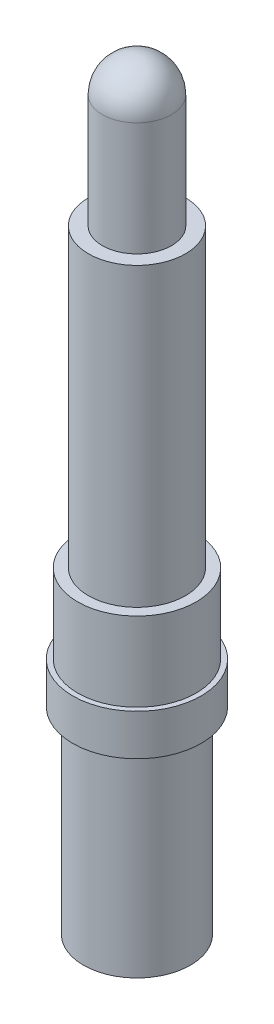
ISO-10303-21;
HEADER;
FILE_DESCRIPTION(('STEP AP214'),'2;1');
FILE_NAME('part.step','',(''),(''),'','','');
FILE_SCHEMA(('AUTOMOTIVE_DESIGN { 1 0 10303 214 1 1 1 1 }'));
ENDSEC;
DATA;
#1=APPLICATION_CONTEXT('core data for automotive mechanical design processes');
#2=APPLICATION_PROTOCOL_DEFINITION('international standard','automotive_design',2000,#1);
#3=PRODUCT_CONTEXT('',#1,'mechanical');
#4=PRODUCT('Part','Part','',(#3));
#5=PRODUCT_RELATED_PRODUCT_CATEGORY('part','',(#4));
#6=PRODUCT_DEFINITION_FORMATION('','',#4);
#7=PRODUCT_DEFINITION_CONTEXT('part definition',#1,'design');
#8=PRODUCT_DEFINITION('design','',#6,#7);
#9=PRODUCT_DEFINITION_SHAPE('','',#8);
#10=(LENGTH_UNIT() NAMED_UNIT(*) SI_UNIT(.MILLI.,.METRE.));
#11=(NAMED_UNIT(*) PLANE_ANGLE_UNIT() SI_UNIT($,.RADIAN.));
#12=(NAMED_UNIT(*) SI_UNIT($,.STERADIAN.) SOLID_ANGLE_UNIT());
#13=UNCERTAINTY_MEASURE_WITH_UNIT(LENGTH_MEASURE(1.E-05),#10,'distance_accuracy_value','');
#14=(GEOMETRIC_REPRESENTATION_CONTEXT(3) GLOBAL_UNCERTAINTY_ASSIGNED_CONTEXT((#13)) GLOBAL_UNIT_ASSIGNED_CONTEXT((#10,
#11,#12)) REPRESENTATION_CONTEXT('',''));
#15=CARTESIAN_POINT('',(0.,0.,0.));
#16=DIRECTION('',(0.,0.,1.));
#17=DIRECTION('',(1.,0.,0.));
#18=AXIS2_PLACEMENT_3D('',#15,#16,#17);
#19=CARTESIAN_POINT('',(0.,11.2268,0.));
#20=DIRECTION('',(0.,1.,0.));
#21=DIRECTION('',(1.,0.,0.));
#22=AXIS2_PLACEMENT_3D('',#19,#20,#21);
#23=SPHERICAL_SURFACE('',#22,0.533399999999996);
#24=CARTESIAN_POINT('',(0.,11.2268,0.));
#25=DIRECTION('',(0.,1.,0.));
#26=DIRECTION('',(0.,0.,1.));
#27=AXIS2_PLACEMENT_3D('',#24,#25,#26);
#28=CIRCLE('',#27,0.5334);
#29=CARTESIAN_POINT('',(0.,11.2268,0.5334));
#30=VERTEX_POINT('',#29);
#31=EDGE_CURVE('E10',#30,#30,#28,.T.);
#32=ORIENTED_EDGE('',*,*,#31,.T.);
#33=EDGE_LOOP('',(#32));
#34=FACE_BOUND('',#33,.T.);
#35=ADVANCED_FACE('F35',(#34),#23,.T.);
#36=CARTESIAN_POINT('',(0.,0.,0.));
#37=DIRECTION('',(0.,1.,0.));
#38=DIRECTION('',(0.,0.,1.));
#39=AXIS2_PLACEMENT_3D('',#36,#37,#38);
#40=CYLINDRICAL_SURFACE('',#39,0.5334);
#41=ORIENTED_EDGE('',*,*,#31,.F.);
#42=EDGE_LOOP('',(#41));
#43=FACE_BOUND('',#42,.T.);
#44=CARTESIAN_POINT('',(0.,9.4742,0.));
#45=DIRECTION('',(0.,1.,0.));
#46=DIRECTION('',(0.,0.,1.));
#47=AXIS2_PLACEMENT_3D('',#44,#45,#46);
#48=CIRCLE('',#47,0.5334);
#49=CARTESIAN_POINT('',(0.,9.4742,0.5334));
#50=VERTEX_POINT('',#49);
#51=EDGE_CURVE('E41',#50,#50,#48,.T.);
#52=ORIENTED_EDGE('',*,*,#51,.T.);
#53=EDGE_LOOP('',(#52));
#54=FACE_BOUND('',#53,.T.);
#55=ADVANCED_FACE('F85',(#43,#54),#40,.T.);
#56=CARTESIAN_POINT('',(0.5334,9.4742,0.));
#57=DIRECTION('',(0.,-1.,0.));
#58=DIRECTION('',(0.,0.,-1.));
#59=AXIS2_PLACEMENT_3D('',#56,#57,#58);
#60=PLANE('',#59);
#61=ORIENTED_EDGE('',*,*,#51,.F.);
#62=EDGE_LOOP('',(#61));
#63=FACE_BOUND('',#62,.T.);
#64=CARTESIAN_POINT('',(0.,9.4742,0.));
#65=DIRECTION('',(0.,1.,0.));
#66=DIRECTION('',(0.,0.,1.));
#67=AXIS2_PLACEMENT_3D('',#64,#65,#66);
#68=CIRCLE('',#67,0.7493);
#69=CARTESIAN_POINT('',(0.,9.4742,0.7493));
#70=VERTEX_POINT('',#69);
#71=EDGE_CURVE('E45',#70,#70,#68,.T.);
#72=ORIENTED_EDGE('',*,*,#71,.T.);
#73=EDGE_LOOP('',(#72));
#74=FACE_BOUND('',#73,.T.);
#75=ADVANCED_FACE('F89',(#63,#74),#60,.F.);
#76=CARTESIAN_POINT('',(0.,0.,0.));
#77=DIRECTION('',(0.,1.,0.));
#78=DIRECTION('',(0.,0.,1.));
#79=AXIS2_PLACEMENT_3D('',#76,#77,#78);
#80=CYLINDRICAL_SURFACE('',#79,0.749299999999999);
#81=ORIENTED_EDGE('',*,*,#71,.F.);
#82=EDGE_LOOP('',(#81));
#83=FACE_BOUND('',#82,.T.);
#84=CARTESIAN_POINT('',(0.,4.9022,0.));
#85=DIRECTION('',(0.,1.,0.));
#86=DIRECTION('',(0.,0.,1.));
#87=AXIS2_PLACEMENT_3D('',#84,#85,#86);
#88=CIRCLE('',#87,0.749299999999999);
#89=CARTESIAN_POINT('',(0.,4.9022,0.749299999999999));
#90=VERTEX_POINT('',#89);
#91=EDGE_CURVE('E49',#90,#90,#88,.T.);
#92=ORIENTED_EDGE('',*,*,#91,.T.);
#93=EDGE_LOOP('',(#92));
#94=FACE_BOUND('',#93,.T.);
#95=ADVANCED_FACE('F94',(#83,#94),#80,.T.);
#96=CARTESIAN_POINT('',(0.749299999999999,4.9022,0.));
#97=DIRECTION('',(0.,-1.,0.));
#98=DIRECTION('',(0.,0.,-1.));
#99=AXIS2_PLACEMENT_3D('',#96,#97,#98);
#100=PLANE('',#99);
#101=ORIENTED_EDGE('',*,*,#91,.F.);
#102=EDGE_LOOP('',(#101));
#103=FACE_BOUND('',#102,.T.);
#104=CARTESIAN_POINT('',(0.,4.9022,0.));
#105=DIRECTION('',(0.,1.,0.));
#106=DIRECTION('',(0.,0.,1.));
#107=AXIS2_PLACEMENT_3D('',#104,#105,#106);
#108=CIRCLE('',#107,0.914399999999999);
#109=CARTESIAN_POINT('',(0.,4.9022,0.914399999999999));
#110=VERTEX_POINT('',#109);
#111=EDGE_CURVE('E54',#110,#110,#108,.T.);
#112=ORIENTED_EDGE('',*,*,#111,.T.);
#113=EDGE_LOOP('',(#112));
#114=FACE_BOUND('',#113,.T.);
#115=ADVANCED_FACE('F100',(#103,#114),#100,.F.);
#116=CARTESIAN_POINT('',(0.,0.,0.));
#117=DIRECTION('',(0.,1.,0.));
#118=DIRECTION('',(0.,0.,1.));
#119=AXIS2_PLACEMENT_3D('',#116,#117,#118);
#120=CYLINDRICAL_SURFACE('',#119,0.9144);
#121=ORIENTED_EDGE('',*,*,#111,.F.);
#122=EDGE_LOOP('',(#121));
#123=FACE_BOUND('',#122,.T.);
#124=CARTESIAN_POINT('',(0.,3.683,0.));
#125=DIRECTION('',(0.,1.,0.));
#126=DIRECTION('',(0.,0.,1.));
#127=AXIS2_PLACEMENT_3D('',#124,#125,#126);
#128=CIRCLE('',#127,0.9144);
#129=CARTESIAN_POINT('',(0.,3.683,0.9144));
#130=VERTEX_POINT('',#129);
#131=EDGE_CURVE('E57',#130,#130,#128,.T.);
#132=ORIENTED_EDGE('',*,*,#131,.T.);
#133=EDGE_LOOP('',(#132));
#134=FACE_BOUND('',#133,.T.);
#135=ADVANCED_FACE('F104',(#123,#134),#120,.T.);
#136=CARTESIAN_POINT('',(0.9144,3.683,0.));
#137=DIRECTION('',(0.,-1.,0.));
#138=DIRECTION('',(0.,0.,-1.));
#139=AXIS2_PLACEMENT_3D('',#136,#137,#138);
#140=PLANE('',#139);
#141=ORIENTED_EDGE('',*,*,#131,.F.);
#142=EDGE_LOOP('',(#141));
#143=FACE_BOUND('',#142,.T.);
#144=CARTESIAN_POINT('',(0.,3.683,0.));
#145=DIRECTION('',(0.,1.,0.));
#146=DIRECTION('',(0.,0.,1.));
#147=AXIS2_PLACEMENT_3D('',#144,#145,#146);
#148=CIRCLE('',#147,0.9906);
#149=CARTESIAN_POINT('',(0.,3.683,0.9906));
#150=VERTEX_POINT('',#149);
#151=EDGE_CURVE('E60',#150,#150,#148,.T.);
#152=ORIENTED_EDGE('',*,*,#151,.T.);
#153=EDGE_LOOP('',(#152));
#154=FACE_BOUND('',#153,.T.);
#155=ADVANCED_FACE('F108',(#143,#154),#140,.F.);
#156=CARTESIAN_POINT('',(0.,0.,0.));
#157=DIRECTION('',(0.,1.,0.));
#158=DIRECTION('',(0.,0.,1.));
#159=AXIS2_PLACEMENT_3D('',#156,#157,#158);
#160=CYLINDRICAL_SURFACE('',#159,0.9906);
#161=ORIENTED_EDGE('',*,*,#151,.F.);
#162=EDGE_LOOP('',(#161));
#163=FACE_BOUND('',#162,.T.);
#164=CARTESIAN_POINT('',(0.,3.048,0.));
#165=DIRECTION('',(0.,1.,0.));
#166=DIRECTION('',(0.,0.,1.));
#167=AXIS2_PLACEMENT_3D('',#164,#165,#166);
#168=CIRCLE('',#167,0.9906);
#169=CARTESIAN_POINT('',(0.,3.048,0.9906));
#170=VERTEX_POINT('',#169);
#171=EDGE_CURVE('E63',#170,#170,#168,.T.);
#172=ORIENTED_EDGE('',*,*,#171,.T.);
#173=EDGE_LOOP('',(#172));
#174=FACE_BOUND('',#173,.T.);
#175=ADVANCED_FACE('F112',(#163,#174),#160,.T.);
#176=CARTESIAN_POINT('',(0.9906,3.048,0.));
#177=DIRECTION('',(0.,1.,0.));
#178=DIRECTION('',(0.,0.,1.));
#179=AXIS2_PLACEMENT_3D('',#176,#177,#178);
#180=PLANE('',#179);
#181=ORIENTED_EDGE('',*,*,#171,.F.);
#182=EDGE_LOOP('',(#181));
#183=FACE_BOUND('',#182,.T.);
#184=CARTESIAN_POINT('',(0.,3.048,0.));
#185=DIRECTION('',(0.,1.,0.));
#186=DIRECTION('',(0.,0.,1.));
#187=AXIS2_PLACEMENT_3D('',#184,#185,#186);
#188=CIRCLE('',#187,0.8255);
#189=CARTESIAN_POINT('',(0.,3.048,0.8255));
#190=VERTEX_POINT('',#189);
#191=EDGE_CURVE('E66',#190,#190,#188,.T.);
#192=ORIENTED_EDGE('',*,*,#191,.T.);
#193=EDGE_LOOP('',(#192));
#194=FACE_BOUND('',#193,.T.);
#195=ADVANCED_FACE('F81',(#183,#194),#180,.F.);
#196=CARTESIAN_POINT('',(0.,0.,0.));
#197=DIRECTION('',(0.,1.,0.));
#198=DIRECTION('',(0.,0.,1.));
#199=AXIS2_PLACEMENT_3D('',#196,#197,#198);
#200=CYLINDRICAL_SURFACE('',#199,0.8255);
#201=ORIENTED_EDGE('',*,*,#191,.F.);
#202=EDGE_LOOP('',(#201));
#203=FACE_BOUND('',#202,.T.);
#204=CARTESIAN_POINT('',(0.,0.,0.));
#205=DIRECTION('',(0.,1.,0.));
#206=DIRECTION('',(0.,0.,1.));
#207=AXIS2_PLACEMENT_3D('',#204,#205,#206);
#208=CIRCLE('',#207,0.8255);
#209=CARTESIAN_POINT('',(0.,0.,0.8255));
#210=VERTEX_POINT('',#209);
#211=EDGE_CURVE('E69',#210,#210,#208,.T.);
#212=ORIENTED_EDGE('',*,*,#211,.T.);
#213=EDGE_LOOP('',(#212));
#214=FACE_BOUND('',#213,.T.);
#215=ADVANCED_FACE('F73',(#203,#214),#200,.T.);
#216=CARTESIAN_POINT('',(0.8255,0.,0.));
#217=DIRECTION('',(0.,1.,0.));
#218=DIRECTION('',(0.,0.,1.));
#219=AXIS2_PLACEMENT_3D('',#216,#217,#218);
#220=PLANE('',#219);
#221=ORIENTED_EDGE('',*,*,#211,.F.);
#222=EDGE_LOOP('',(#221));
#223=FACE_BOUND('',#222,.T.);
#224=ADVANCED_FACE('F75',(#223),#220,.F.);
#225=CLOSED_SHELL('',(#35,#55,#75,#95,#115,#135,#155,#175,#195,#215,#224));
#226=MANIFOLD_SOLID_BREP('B2',#225);
#227=ADVANCED_BREP_SHAPE_REPRESENTATION('',(#18,#226),#14);
#228=SHAPE_DEFINITION_REPRESENTATION(#9,#227);
ENDSEC;
END-ISO-10303-21;
